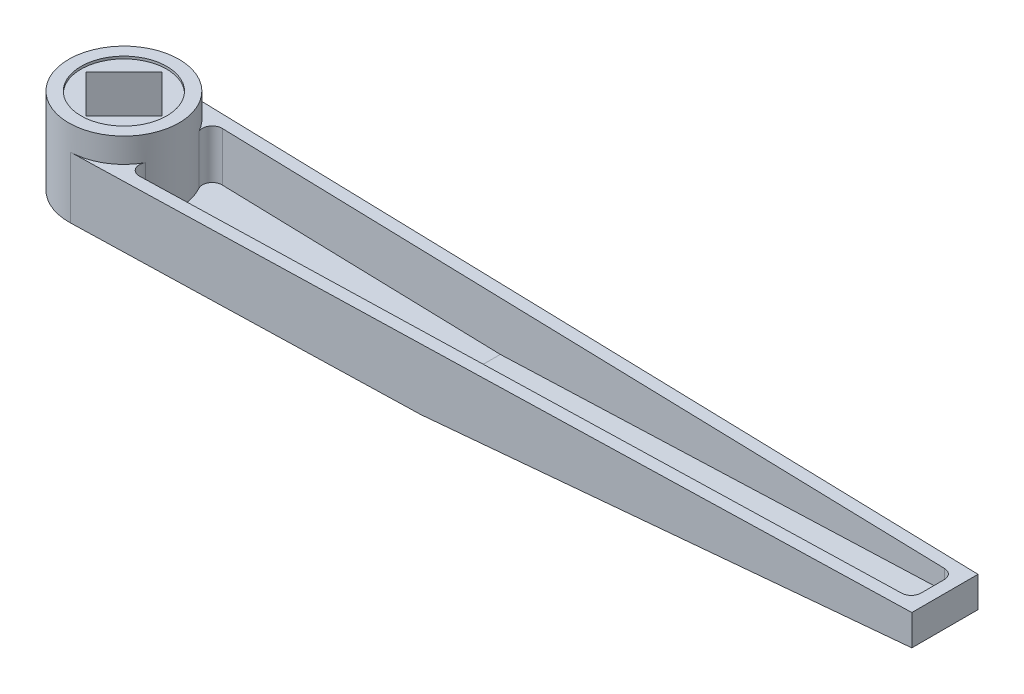
ISO-10303-21;
HEADER;
FILE_DESCRIPTION(('STEP AP214'),'2;1');
FILE_NAME('part.step','',(''),(''),'','','');
FILE_SCHEMA(('AUTOMOTIVE_DESIGN { 1 0 10303 214 1 1 1 1 }'));
ENDSEC;
DATA;
#1=APPLICATION_CONTEXT('core data for automotive mechanical design processes');
#2=APPLICATION_PROTOCOL_DEFINITION('international standard','automotive_design',2000,#1);
#3=PRODUCT_CONTEXT('',#1,'mechanical');
#4=PRODUCT('Part','Part','',(#3));
#5=PRODUCT_RELATED_PRODUCT_CATEGORY('part','',(#4));
#6=PRODUCT_DEFINITION_FORMATION('','',#4);
#7=PRODUCT_DEFINITION_CONTEXT('part definition',#1,'design');
#8=PRODUCT_DEFINITION('design','',#6,#7);
#9=PRODUCT_DEFINITION_SHAPE('','',#8);
#10=(LENGTH_UNIT() NAMED_UNIT(*) SI_UNIT(.MILLI.,.METRE.));
#11=(NAMED_UNIT(*) PLANE_ANGLE_UNIT() SI_UNIT($,.RADIAN.));
#12=(NAMED_UNIT(*) SI_UNIT($,.STERADIAN.) SOLID_ANGLE_UNIT());
#13=UNCERTAINTY_MEASURE_WITH_UNIT(LENGTH_MEASURE(1.E-05),#10,'distance_accuracy_value','');
#14=(GEOMETRIC_REPRESENTATION_CONTEXT(3) GLOBAL_UNCERTAINTY_ASSIGNED_CONTEXT((#13)) GLOBAL_UNIT_ASSIGNED_CONTEXT((#10,
#11,#12)) REPRESENTATION_CONTEXT('',''));
#15=CARTESIAN_POINT('',(0.,0.,0.));
#16=DIRECTION('',(0.,0.,1.));
#17=DIRECTION('',(1.,0.,0.));
#18=AXIS2_PLACEMENT_3D('',#15,#16,#17);
#19=CARTESIAN_POINT('',(0.,34.,0.));
#20=DIRECTION('',(0.,1.,0.));
#21=DIRECTION('',(0.,0.,1.));
#22=AXIS2_PLACEMENT_3D('',#19,#20,#21);
#23=PLANE('',#22);
#24=CARTESIAN_POINT('',(0.,34.,0.));
#25=DIRECTION('',(0.,1.,0.));
#26=DIRECTION('',(0.,0.,1.));
#27=AXIS2_PLACEMENT_3D('',#24,#25,#26);
#28=CIRCLE('',#27,17.5);
#29=CARTESIAN_POINT('',(0.,34.,17.5));
#30=VERTEX_POINT('',#29);
#31=EDGE_CURVE('E232',#30,#30,#28,.T.);
#32=ORIENTED_EDGE('',*,*,#31,.T.);
#33=EDGE_LOOP('',(#32));
#34=FACE_BOUND('',#33,.T.);
#35=DIRECTION('',(-0.707106781186548,0.,0.707106781186548));
#36=VECTOR('',#35,1.);
#37=CARTESIAN_POINT('',(7.77817459305201,34.,7.77817459305201));
#38=LINE('',#37,#36);
#39=CARTESIAN_POINT('',(15.556349186104,34.,0.));
#40=VERTEX_POINT('',#39);
#41=CARTESIAN_POINT('',(0.,34.,15.556349186104));
#42=VERTEX_POINT('',#41);
#43=EDGE_CURVE('E222',#40,#42,#38,.T.);
#44=ORIENTED_EDGE('',*,*,#43,.T.);
#45=DIRECTION('',(-0.707106781186548,0.,-0.707106781186547));
#46=VECTOR('',#45,1.);
#47=CARTESIAN_POINT('',(-7.77817459305201,34.,7.77817459305201));
#48=LINE('',#47,#46);
#49=CARTESIAN_POINT('',(-15.556349186104,34.,0.));
#50=VERTEX_POINT('',#49);
#51=EDGE_CURVE('E189',#42,#50,#48,.T.);
#52=ORIENTED_EDGE('',*,*,#51,.T.);
#53=DIRECTION('',(0.707106781186547,0.,-0.707106781186548));
#54=VECTOR('',#53,1.);
#55=CARTESIAN_POINT('',(-7.77817459305204,34.,-7.77817459305203));
#56=LINE('',#55,#54);
#57=CARTESIAN_POINT('',(0.,34.,-15.5563491861041));
#58=VERTEX_POINT('',#57);
#59=EDGE_CURVE('E192',#50,#58,#56,.T.);
#60=ORIENTED_EDGE('',*,*,#59,.T.);
#61=DIRECTION('',(0.707106781186548,0.,0.707106781186547));
#62=VECTOR('',#61,1.);
#63=CARTESIAN_POINT('',(7.77817459305203,34.,-7.77817459305204));
#64=LINE('',#63,#62);
#65=EDGE_CURVE('E219',#58,#40,#64,.T.);
#66=ORIENTED_EDGE('',*,*,#65,.T.);
#67=EDGE_LOOP('',(#44,#52,#60,#66));
#68=FACE_BOUND('',#67,.T.);
#69=ADVANCED_FACE('F57',(#34,#68),#23,.T.);
#70=CARTESIAN_POINT('',(0.,1.,0.));
#71=DIRECTION('',(0.,-1.,0.));
#72=DIRECTION('',(0.,0.,-1.));
#73=AXIS2_PLACEMENT_3D('',#70,#71,#72);
#74=PLANE('',#73);
#75=CARTESIAN_POINT('',(0.,1.,0.));
#76=DIRECTION('',(0.,-1.,0.));
#77=DIRECTION('',(0.,0.,-1.));
#78=AXIS2_PLACEMENT_3D('',#75,#76,#77);
#79=CIRCLE('',#78,17.5);
#80=CARTESIAN_POINT('',(0.,1.,-17.5));
#81=VERTEX_POINT('',#80);
#82=EDGE_CURVE('E226',#81,#81,#79,.T.);
#83=ORIENTED_EDGE('',*,*,#82,.T.);
#84=EDGE_LOOP('',(#83));
#85=FACE_BOUND('',#84,.T.);
#86=DIRECTION('',(-0.707106781186547,0.,0.707106781186548));
#87=VECTOR('',#86,1.);
#88=CARTESIAN_POINT('',(0.,1.,-15.5563491861041));
#89=LINE('',#88,#87);
#90=CARTESIAN_POINT('',(0.,1.,-15.5563491861041));
#91=VERTEX_POINT('',#90);
#92=CARTESIAN_POINT('',(-15.556349186104,1.,0.));
#93=VERTEX_POINT('',#92);
#94=EDGE_CURVE('E207',#91,#93,#89,.T.);
#95=ORIENTED_EDGE('',*,*,#94,.T.);
#96=DIRECTION('',(0.707106781186548,0.,0.707106781186547));
#97=VECTOR('',#96,1.);
#98=CARTESIAN_POINT('',(-15.556349186104,1.,0.));
#99=LINE('',#98,#97);
#100=CARTESIAN_POINT('',(0.,1.,15.556349186104));
#101=VERTEX_POINT('',#100);
#102=EDGE_CURVE('E186',#93,#101,#99,.T.);
#103=ORIENTED_EDGE('',*,*,#102,.T.);
#104=DIRECTION('',(0.707106781186548,0.,-0.707106781186548));
#105=VECTOR('',#104,1.);
#106=CARTESIAN_POINT('',(15.556349186104,1.,0.));
#107=LINE('',#106,#105);
#108=CARTESIAN_POINT('',(15.556349186104,1.,0.));
#109=VERTEX_POINT('',#108);
#110=EDGE_CURVE('E196',#101,#109,#107,.T.);
#111=ORIENTED_EDGE('',*,*,#110,.T.);
#112=DIRECTION('',(-0.707106781186548,0.,-0.707106781186547));
#113=VECTOR('',#112,1.);
#114=CARTESIAN_POINT('',(0.,1.,-15.5563491861041));
#115=LINE('',#114,#113);
#116=EDGE_CURVE('E202',#109,#91,#115,.T.);
#117=ORIENTED_EDGE('',*,*,#116,.T.);
#118=EDGE_LOOP('',(#95,#103,#111,#117));
#119=FACE_BOUND('',#118,.T.);
#120=ADVANCED_FACE('F205',(#85,#119),#74,.T.);
#121=CARTESIAN_POINT('',(-124.155415208462,25.,0.));
#122=DIRECTION('',(0.,1.,0.));
#123=DIRECTION('',(0.,0.,1.));
#124=AXIS2_PLACEMENT_3D('',#121,#122,#123);
#125=PLANE('',#124);
#126=DIRECTION('',(0.999638661252636,0.,0.0268802330539983));
#127=VECTOR('',#126,1.);
#128=CARTESIAN_POINT('',(-123.460901850765,25.,-25.8279904685282));
#129=LINE('',#128,#127);
#130=CARTESIAN_POINT('',(0.604805243714965,25.,-22.4918698781843));
#131=VERTEX_POINT('',#130);
#132=CARTESIAN_POINT('',(335.,25.,-13.5));
#133=VERTEX_POINT('',#132);
#134=EDGE_CURVE('E283',#131,#133,#129,.T.);
#135=ORIENTED_EDGE('',*,*,#134,.F.);
#136=CARTESIAN_POINT('',(0.,25.,0.));
#137=DIRECTION('',(0.,1.,0.));
#138=DIRECTION('',(0.,0.,1.));
#139=AXIS2_PLACEMENT_3D('',#136,#137,#138);
#140=CIRCLE('',#139,22.5);
#141=CARTESIAN_POINT('',(19.6625817653894,25.,-10.9376815788072));
#142=VERTEX_POINT('',#141);
#143=EDGE_CURVE('E246',#131,#142,#140,.F.);
#144=ORIENTED_EDGE('',*,*,#143,.T.);
#145=CARTESIAN_POINT('',(23.1581518570141,25.,-12.8821583039285));
#146=DIRECTION('',(0.,1.,0.));
#147=DIRECTION('',(0.,0.,1.));
#148=AXIS2_PLACEMENT_3D('',#145,#146,#147);
#149=CIRCLE('',#148,4.);
#150=CARTESIAN_POINT('',(23.2656727892302,25.,-16.880712948939));
#151=VERTEX_POINT('',#150);
#152=EDGE_CURVE('E333',#142,#151,#149,.F.);
#153=ORIENTED_EDGE('',*,*,#152,.T.);
#154=DIRECTION('',(0.999638661252636,0.,0.0268802330539983));
#155=VECTOR('',#154,1.);
#156=CARTESIAN_POINT('',(-123.595303016035,25.,-20.829797162265));
#157=LINE('',#156,#155);
#158=CARTESIAN_POINT('',(326.107520932216,25.,-8.73731096568009));
#159=VERTEX_POINT('',#158);
#160=EDGE_CURVE('E269',#151,#159,#157,.T.);
#161=ORIENTED_EDGE('',*,*,#160,.T.);
#162=CARTESIAN_POINT('',(326.,25.,-4.73875632066954));
#163=DIRECTION('',(0.,1.,0.));
#164=DIRECTION('',(0.,0.,1.));
#165=AXIS2_PLACEMENT_3D('',#162,#163,#164);
#166=CIRCLE('',#165,4.);
#167=CARTESIAN_POINT('',(330.,25.,-4.73875632066954));
#168=VERTEX_POINT('',#167);
#169=EDGE_CURVE('E12',#159,#168,#166,.F.);
#170=ORIENTED_EDGE('',*,*,#169,.T.);
#171=DIRECTION('',(0.,0.,1.));
#172=VECTOR('',#171,1.);
#173=CARTESIAN_POINT('',(330.,25.,0.));
#174=LINE('',#173,#172);
#175=CARTESIAN_POINT('',(330.,25.,4.73875632066954));
#176=VERTEX_POINT('',#175);
#177=EDGE_CURVE('E258',#168,#176,#174,.T.);
#178=ORIENTED_EDGE('',*,*,#177,.T.);
#179=CARTESIAN_POINT('',(326.,25.,4.73875632066954));
#180=DIRECTION('',(0.,1.,0.));
#181=DIRECTION('',(0.,0.,1.));
#182=AXIS2_PLACEMENT_3D('',#179,#180,#181);
#183=CIRCLE('',#182,4.);
#184=CARTESIAN_POINT('',(326.107520932216,25.,8.73731096568009));
#185=VERTEX_POINT('',#184);
#186=EDGE_CURVE('E65',#176,#185,#183,.F.);
#187=ORIENTED_EDGE('',*,*,#186,.T.);
#188=DIRECTION('',(0.999638661252636,0.,-0.0268802330539983));
#189=VECTOR('',#188,1.);
#190=CARTESIAN_POINT('',(-123.595303016035,25.,20.829797162265));
#191=LINE('',#190,#189);
#192=CARTESIAN_POINT('',(23.2656727892302,25.,16.880712948939));
#193=VERTEX_POINT('',#192);
#194=EDGE_CURVE('E266',#193,#185,#191,.T.);
#195=ORIENTED_EDGE('',*,*,#194,.F.);
#196=CARTESIAN_POINT('',(23.1581518570141,25.,12.8821583039285));
#197=DIRECTION('',(0.,1.,0.));
#198=DIRECTION('',(0.,0.,1.));
#199=AXIS2_PLACEMENT_3D('',#196,#197,#198);
#200=CIRCLE('',#199,4.);
#201=CARTESIAN_POINT('',(19.6625817653894,25.,10.9376815788072));
#202=VERTEX_POINT('',#201);
#203=EDGE_CURVE('E335',#193,#202,#200,.F.);
#204=ORIENTED_EDGE('',*,*,#203,.T.);
#205=CARTESIAN_POINT('',(0.604805243714965,25.,22.4918698781843));
#206=VERTEX_POINT('',#205);
#207=EDGE_CURVE('E248',#202,#206,#140,.F.);
#208=ORIENTED_EDGE('',*,*,#207,.T.);
#209=DIRECTION('',(0.999638661252636,0.,-0.0268802330539983));
#210=VECTOR('',#209,1.);
#211=CARTESIAN_POINT('',(-123.460901850765,25.,25.8279904685282));
#212=LINE('',#211,#210);
#213=CARTESIAN_POINT('',(335.,25.,13.5));
#214=VERTEX_POINT('',#213);
#215=EDGE_CURVE('E287',#206,#214,#212,.T.);
#216=ORIENTED_EDGE('',*,*,#215,.T.);
#217=DIRECTION('',(0.,0.,1.));
#218=VECTOR('',#217,1.);
#219=CARTESIAN_POINT('',(335.,25.,0.));
#220=LINE('',#219,#218);
#221=EDGE_CURVE('E280',#133,#214,#220,.T.);
#222=ORIENTED_EDGE('',*,*,#221,.F.);
#223=EDGE_LOOP('',(#135,#144,#153,#161,#170,#178,#187,#195,#204,#208,#216,#222));
#224=FACE_BOUND('',#223,.T.);
#225=ADVANCED_FACE('F340',(#224),#125,.T.);
#226=CARTESIAN_POINT('',(-124.155415208462,5.,0.));
#227=DIRECTION('',(0.,1.,0.));
#228=DIRECTION('',(0.,0.,1.));
#229=AXIS2_PLACEMENT_3D('',#226,#227,#228);
#230=PLANE('',#229);
#231=DIRECTION('',(0.999638661252636,0.,0.0268802330539983));
#232=VECTOR('',#231,1.);
#233=CARTESIAN_POINT('',(-123.595303016035,5.,-20.829797162265));
#234=LINE('',#233,#232);
#235=CARTESIAN_POINT('',(23.2656727892302,5.,-16.880712948939));
#236=VERTEX_POINT('',#235);
#237=CARTESIAN_POINT('',(139.839907881324,5.,-13.7460376619304));
#238=VERTEX_POINT('',#237);
#239=EDGE_CURVE('E249',#236,#238,#234,.T.);
#240=ORIENTED_EDGE('',*,*,#239,.F.);
#241=CARTESIAN_POINT('',(23.1581518570141,5.,-12.8821583039285));
#242=DIRECTION('',(0.,1.,0.));
#243=DIRECTION('',(0.,0.,1.));
#244=AXIS2_PLACEMENT_3D('',#241,#242,#243);
#245=CIRCLE('',#244,4.);
#246=CARTESIAN_POINT('',(19.6625817653894,5.,-10.9376815788072));
#247=VERTEX_POINT('',#246);
#248=EDGE_CURVE('E317',#236,#247,#245,.T.);
#249=ORIENTED_EDGE('',*,*,#248,.T.);
#250=CARTESIAN_POINT('',(0.,5.,0.));
#251=DIRECTION('',(0.,1.,0.));
#252=DIRECTION('',(0.,0.,1.));
#253=AXIS2_PLACEMENT_3D('',#250,#251,#252);
#254=CIRCLE('',#253,22.5);
#255=CARTESIAN_POINT('',(19.6625817653894,5.,10.9376815788072));
#256=VERTEX_POINT('',#255);
#257=EDGE_CURVE('E241',#247,#256,#254,.F.);
#258=ORIENTED_EDGE('',*,*,#257,.T.);
#259=CARTESIAN_POINT('',(23.1581518570141,5.,12.8821583039285));
#260=DIRECTION('',(0.,1.,0.));
#261=DIRECTION('',(0.,0.,1.));
#262=AXIS2_PLACEMENT_3D('',#259,#260,#261);
#263=CIRCLE('',#262,4.);
#264=CARTESIAN_POINT('',(23.2656727892302,5.,16.880712948939));
#265=VERTEX_POINT('',#264);
#266=EDGE_CURVE('E315',#256,#265,#263,.T.);
#267=ORIENTED_EDGE('',*,*,#266,.T.);
#268=DIRECTION('',(0.999638661252636,0.,-0.0268802330539983));
#269=VECTOR('',#268,1.);
#270=CARTESIAN_POINT('',(-123.595303016035,5.,20.829797162265));
#271=LINE('',#270,#269);
#272=CARTESIAN_POINT('',(139.839907881324,5.,13.7460376619304));
#273=VERTEX_POINT('',#272);
#274=EDGE_CURVE('E251',#265,#273,#271,.T.);
#275=ORIENTED_EDGE('',*,*,#274,.T.);
#276=DIRECTION('',(0.,0.,1.));
#277=VECTOR('',#276,1.);
#278=CARTESIAN_POINT('',(139.839907881324,5.,0.));
#279=LINE('',#278,#277);
#280=EDGE_CURVE('E253',#238,#273,#279,.T.);
#281=ORIENTED_EDGE('',*,*,#280,.F.);
#282=EDGE_LOOP('',(#240,#249,#258,#267,#275,#281));
#283=FACE_BOUND('',#282,.T.);
#284=ADVANCED_FACE('F365',(#283),#230,.T.);
#285=CARTESIAN_POINT('',(-123.595303016035,25.,20.829797162265));
#286=DIRECTION('',(-0.0268802330539983,0.,-0.999638661252636));
#287=DIRECTION('',(-0.999638661252636,0.,0.0268802330539983));
#288=AXIS2_PLACEMENT_3D('',#285,#286,#287);
#289=PLANE('',#288);
#290=ORIENTED_EDGE('',*,*,#274,.F.);
#291=DIRECTION('',(0.,-1.,0.));
#292=VECTOR('',#291,1.);
#293=CARTESIAN_POINT('',(23.2656727892302,25.,16.880712948939));
#294=LINE('',#293,#292);
#295=EDGE_CURVE('E322',#265,#193,#294,.F.);
#296=ORIENTED_EDGE('',*,*,#295,.T.);
#297=ORIENTED_EDGE('',*,*,#194,.T.);
#298=DIRECTION('',(0.,-1.,0.));
#299=VECTOR('',#298,1.);
#300=CARTESIAN_POINT('',(326.107520932216,25.,8.73731096568009));
#301=LINE('',#300,#299);
#302=CARTESIAN_POINT('',(326.107520932216,16.9402316058265,8.73731096568009));
#303=VERTEX_POINT('',#302);
#304=EDGE_CURVE('E319',#185,#303,#301,.T.);
#305=ORIENTED_EDGE('',*,*,#304,.T.);
#306=DIRECTION('',(0.997592617173697,0.0639482446906216,-0.0268252150321745));
#307=VECTOR('',#306,1.);
#308=CARTESIAN_POINT('',(-121.242130924735,-11.7360281285935,20.7665204837189));
#309=LINE('',#308,#307);
#310=EDGE_CURVE('E252',#273,#303,#309,.T.);
#311=ORIENTED_EDGE('',*,*,#310,.F.);
#312=EDGE_LOOP('',(#290,#296,#297,#305,#311));
#313=FACE_BOUND('',#312,.T.);
#314=ADVANCED_FACE('F345',(#313),#289,.T.);
#315=CARTESIAN_POINT('',(-123.595303016035,25.,-20.829797162265));
#316=DIRECTION('',(0.0268802330539983,0.,-0.999638661252636));
#317=DIRECTION('',(-0.999638661252636,0.,-0.0268802330539983));
#318=AXIS2_PLACEMENT_3D('',#315,#316,#317);
#319=PLANE('',#318);
#320=ORIENTED_EDGE('',*,*,#160,.F.);
#321=DIRECTION('',(0.,1.,0.));
#322=VECTOR('',#321,1.);
#323=CARTESIAN_POINT('',(23.2656727892301,5.,-16.880712948939));
#324=LINE('',#323,#322);
#325=EDGE_CURVE('E313',#151,#236,#324,.F.);
#326=ORIENTED_EDGE('',*,*,#325,.T.);
#327=ORIENTED_EDGE('',*,*,#239,.T.);
#328=DIRECTION('',(0.997592617173697,0.0639482446906216,0.0268252150321745));
#329=VECTOR('',#328,1.);
#330=CARTESIAN_POINT('',(-121.242130924735,-11.7360281285935,-20.7665204837189));
#331=LINE('',#330,#329);
#332=CARTESIAN_POINT('',(326.107520932216,16.9402316058265,-8.73731096568009));
#333=VERTEX_POINT('',#332);
#334=EDGE_CURVE('E262',#238,#333,#331,.T.);
#335=ORIENTED_EDGE('',*,*,#334,.T.);
#336=DIRECTION('',(0.,-1.,0.));
#337=VECTOR('',#336,1.);
#338=CARTESIAN_POINT('',(326.107520932216,25.,-8.73731096568009));
#339=LINE('',#338,#337);
#340=EDGE_CURVE('E311',#333,#159,#339,.F.);
#341=ORIENTED_EDGE('',*,*,#340,.T.);
#342=EDGE_LOOP('',(#320,#326,#327,#335,#341));
#343=FACE_BOUND('',#342,.T.);
#344=ADVANCED_FACE('F359',(#343),#319,.F.);
#345=CARTESIAN_POINT('',(-124.155415208462,0.,0.));
#346=DIRECTION('',(0.,1.,0.));
#347=DIRECTION('',(0.,0.,1.));
#348=AXIS2_PLACEMENT_3D('',#345,#346,#347);
#349=PLANE('',#348);
#350=CARTESIAN_POINT('',(0.,0.,0.));
#351=DIRECTION('',(0.,-1.,0.));
#352=DIRECTION('',(0.,0.,-1.));
#353=AXIS2_PLACEMENT_3D('',#350,#351,#352);
#354=CIRCLE('',#353,17.5);
#355=CARTESIAN_POINT('',(0.,0.,-17.5));
#356=VERTEX_POINT('',#355);
#357=EDGE_CURVE('E225',#356,#356,#354,.T.);
#358=ORIENTED_EDGE('',*,*,#357,.F.);
#359=EDGE_LOOP('',(#358));
#360=FACE_BOUND('',#359,.T.);
#361=CARTESIAN_POINT('',(0.,0.,0.));
#362=DIRECTION('',(0.,1.,0.));
#363=DIRECTION('',(0.,0.,1.));
#364=AXIS2_PLACEMENT_3D('',#361,#362,#363);
#365=CIRCLE('',#364,22.5);
#366=CARTESIAN_POINT('',(0.604805243714965,0.,-22.4918698781843));
#367=VERTEX_POINT('',#366);
#368=CARTESIAN_POINT('',(0.604805243714965,0.,22.4918698781843));
#369=VERTEX_POINT('',#368);
#370=EDGE_CURVE('E235',#367,#369,#365,.T.);
#371=ORIENTED_EDGE('',*,*,#370,.F.);
#372=DIRECTION('',(0.999638661252636,0.,0.0268802330539983));
#373=VECTOR('',#372,1.);
#374=CARTESIAN_POINT('',(-123.460901850765,0.,-25.8279904685282));
#375=LINE('',#374,#373);
#376=CARTESIAN_POINT('',(140.,0.,-18.7435401397555));
#377=VERTEX_POINT('',#376);
#378=EDGE_CURVE('E279',#367,#377,#375,.T.);
#379=ORIENTED_EDGE('',*,*,#378,.T.);
#380=DIRECTION('',(0.,0.,1.));
#381=VECTOR('',#380,1.);
#382=CARTESIAN_POINT('',(140.,0.,-22.4918698781843));
#383=LINE('',#382,#381);
#384=CARTESIAN_POINT('',(140.,0.,18.7435401397555));
#385=VERTEX_POINT('',#384);
#386=EDGE_CURVE('E272',#377,#385,#383,.T.);
#387=ORIENTED_EDGE('',*,*,#386,.T.);
#388=DIRECTION('',(0.999638661252636,0.,-0.0268802330539983));
#389=VECTOR('',#388,1.);
#390=CARTESIAN_POINT('',(-123.460901850765,0.,25.8279904685282));
#391=LINE('',#390,#389);
#392=EDGE_CURVE('E284',#369,#385,#391,.T.);
#393=ORIENTED_EDGE('',*,*,#392,.F.);
#394=EDGE_LOOP('',(#371,#379,#387,#393));
#395=FACE_BOUND('',#394,.T.);
#396=ADVANCED_FACE('F383',(#360,#395),#349,.F.);
#397=CARTESIAN_POINT('',(-123.460901850765,25.,25.8279904685282));
#398=DIRECTION('',(-0.0268802330539983,0.,-0.999638661252636));
#399=DIRECTION('',(-0.999638661252636,0.,0.0268802330539983));
#400=AXIS2_PLACEMENT_3D('',#397,#398,#399);
#401=PLANE('',#400);
#402=ORIENTED_EDGE('',*,*,#392,.T.);
#403=DIRECTION('',(0.997592617173697,0.0639482446906216,-0.0268252150321745));
#404=VECTOR('',#403,1.);
#405=CARTESIAN_POINT('',(-120.788653215522,-16.7172213599694,25.7561338378497));
#406=LINE('',#405,#404);
#407=CARTESIAN_POINT('',(335.,12.5,13.5));
#408=VERTEX_POINT('',#407);
#409=EDGE_CURVE('E275',#385,#408,#406,.T.);
#410=ORIENTED_EDGE('',*,*,#409,.T.);
#411=DIRECTION('',(0.,-1.,0.));
#412=VECTOR('',#411,1.);
#413=CARTESIAN_POINT('',(335.,25.,13.5));
#414=LINE('',#413,#412);
#415=EDGE_CURVE('E289',#214,#408,#414,.T.);
#416=ORIENTED_EDGE('',*,*,#415,.F.);
#417=ORIENTED_EDGE('',*,*,#215,.F.);
#418=DIRECTION('',(0.,-1.,0.));
#419=VECTOR('',#418,1.);
#420=CARTESIAN_POINT('',(0.604805243714965,25.,22.4918698781843));
#421=LINE('',#420,#419);
#422=EDGE_CURVE('E296',#206,#369,#421,.T.);
#423=ORIENTED_EDGE('',*,*,#422,.T.);
#424=EDGE_LOOP('',(#402,#410,#416,#417,#423));
#425=FACE_BOUND('',#424,.T.);
#426=ADVANCED_FACE('F376',(#425),#401,.F.);
#427=CARTESIAN_POINT('',(335.,25.,0.));
#428=DIRECTION('',(1.,0.,0.));
#429=DIRECTION('',(0.,0.,-1.));
#430=AXIS2_PLACEMENT_3D('',#427,#428,#429);
#431=PLANE('',#430);
#432=DIRECTION('',(0.,0.,1.));
#433=VECTOR('',#432,1.);
#434=CARTESIAN_POINT('',(335.,12.5,-22.4918698781843));
#435=LINE('',#434,#433);
#436=CARTESIAN_POINT('',(335.,12.5,-13.5));
#437=VERTEX_POINT('',#436);
#438=EDGE_CURVE('E265',#437,#408,#435,.T.);
#439=ORIENTED_EDGE('',*,*,#438,.F.);
#440=DIRECTION('',(0.,-1.,0.));
#441=VECTOR('',#440,1.);
#442=CARTESIAN_POINT('',(335.,25.,-13.5));
#443=LINE('',#442,#441);
#444=EDGE_CURVE('E301',#133,#437,#443,.T.);
#445=ORIENTED_EDGE('',*,*,#444,.F.);
#446=ORIENTED_EDGE('',*,*,#221,.T.);
#447=ORIENTED_EDGE('',*,*,#415,.T.);
#448=EDGE_LOOP('',(#439,#445,#446,#447));
#449=FACE_BOUND('',#448,.T.);
#450=ADVANCED_FACE('F387',(#449),#431,.T.);
#451=CARTESIAN_POINT('',(-123.460901850765,25.,-25.8279904685282));
#452=DIRECTION('',(0.0268802330539983,0.,-0.999638661252636));
#453=DIRECTION('',(-0.999638661252636,0.,-0.0268802330539983));
#454=AXIS2_PLACEMENT_3D('',#451,#452,#453);
#455=PLANE('',#454);
#456=DIRECTION('',(0.997592617173697,0.0639482446906216,0.0268252150321745));
#457=VECTOR('',#456,1.);
#458=CARTESIAN_POINT('',(-120.788653215522,-16.7172213599694,-25.7561338378497));
#459=LINE('',#458,#457);
#460=EDGE_CURVE('E304',#377,#437,#459,.T.);
#461=ORIENTED_EDGE('',*,*,#460,.F.);
#462=ORIENTED_EDGE('',*,*,#378,.F.);
#463=DIRECTION('',(0.,-1.,0.));
#464=VECTOR('',#463,1.);
#465=CARTESIAN_POINT('',(0.604805243714965,25.,-22.4918698781843));
#466=LINE('',#465,#464);
#467=EDGE_CURVE('E298',#131,#367,#466,.T.);
#468=ORIENTED_EDGE('',*,*,#467,.F.);
#469=ORIENTED_EDGE('',*,*,#134,.T.);
#470=ORIENTED_EDGE('',*,*,#444,.T.);
#471=EDGE_LOOP('',(#461,#462,#468,#469,#470));
#472=FACE_BOUND('',#471,.T.);
#473=ADVANCED_FACE('F390',(#472),#455,.T.);
#474=CARTESIAN_POINT('',(335.,12.5,-22.4918698781843));
#475=DIRECTION('',(-0.063971265443343,0.997951740916151,0.));
#476=DIRECTION('',(-0.997951740916152,-0.063971265443343,0.));
#477=AXIS2_PLACEMENT_3D('',#474,#475,#476);
#478=PLANE('',#477);
#479=ORIENTED_EDGE('',*,*,#386,.F.);
#480=ORIENTED_EDGE('',*,*,#460,.T.);
#481=ORIENTED_EDGE('',*,*,#438,.T.);
#482=ORIENTED_EDGE('',*,*,#409,.F.);
#483=EDGE_LOOP('',(#479,#480,#481,#482));
#484=FACE_BOUND('',#483,.T.);
#485=ADVANCED_FACE('F391',(#484),#478,.F.);
#486=CARTESIAN_POINT('',(330.,25.,0.));
#487=DIRECTION('',(1.,0.,0.));
#488=DIRECTION('',(0.,0.,-1.));
#489=AXIS2_PLACEMENT_3D('',#486,#487,#488);
#490=PLANE('',#489);
#491=DIRECTION('',(0.,0.,1.));
#492=VECTOR('',#491,1.);
#493=CARTESIAN_POINT('',(330.,17.189749494787,0.));
#494=LINE('',#493,#492);
#495=CARTESIAN_POINT('',(330.,17.189749494787,-4.73875632066954));
#496=VERTEX_POINT('',#495);
#497=CARTESIAN_POINT('',(330.,17.189749494787,4.73875632066954));
#498=VERTEX_POINT('',#497);
#499=EDGE_CURVE('E256',#496,#498,#494,.T.);
#500=ORIENTED_EDGE('',*,*,#499,.T.);
#501=DIRECTION('',(0.,-1.,0.));
#502=VECTOR('',#501,1.);
#503=CARTESIAN_POINT('',(330.,25.,4.73875632066954));
#504=LINE('',#503,#502);
#505=EDGE_CURVE('E72',#498,#176,#504,.F.);
#506=ORIENTED_EDGE('',*,*,#505,.T.);
#507=ORIENTED_EDGE('',*,*,#177,.F.);
#508=DIRECTION('',(0.,-1.,0.));
#509=VECTOR('',#508,1.);
#510=CARTESIAN_POINT('',(330.,17.189749494787,-4.73875632066954));
#511=LINE('',#510,#509);
#512=EDGE_CURVE('E329',#168,#496,#511,.T.);
#513=ORIENTED_EDGE('',*,*,#512,.T.);
#514=EDGE_LOOP('',(#500,#506,#507,#513));
#515=FACE_BOUND('',#514,.T.);
#516=ADVANCED_FACE('F352',(#515),#490,.F.);
#517=CARTESIAN_POINT('',(334.680143672783,17.4897587045808,-22.4918698781843));
#518=DIRECTION('',(-0.063971265443343,0.997951740916151,0.));
#519=DIRECTION('',(-0.997951740916152,-0.063971265443343,0.));
#520=AXIS2_PLACEMENT_3D('',#517,#518,#519);
#521=PLANE('',#520);
#522=ORIENTED_EDGE('',*,*,#310,.T.);
#523=CARTESIAN_POINT('',(326.,16.9333392383767,4.73875632066954));
#524=DIRECTION('',(-0.063971265443343,0.997951740916151,0.));
#525=DIRECTION('',(-0.997951740916152,-0.063971265443343,0.));
#526=AXIS2_PLACEMENT_3D('',#523,#524,#525);
#527=ELLIPSE('',#526,4.00820985223982,4.);
#528=EDGE_CURVE('E327',#303,#498,#527,.T.);
#529=ORIENTED_EDGE('',*,*,#528,.T.);
#530=ORIENTED_EDGE('',*,*,#499,.F.);
#531=CARTESIAN_POINT('',(326.,16.9333392383767,-4.73875632066954));
#532=DIRECTION('',(-0.063971265443343,0.997951740916151,0.));
#533=DIRECTION('',(0.997951740916152,0.063971265443343,0.));
#534=AXIS2_PLACEMENT_3D('',#531,#532,#533);
#535=ELLIPSE('',#534,4.00820985223982,4.);
#536=EDGE_CURVE('E325',#496,#333,#535,.T.);
#537=ORIENTED_EDGE('',*,*,#536,.T.);
#538=ORIENTED_EDGE('',*,*,#334,.F.);
#539=ORIENTED_EDGE('',*,*,#280,.T.);
#540=EDGE_LOOP('',(#522,#529,#530,#537,#538,#539));
#541=FACE_BOUND('',#540,.T.);
#542=ADVANCED_FACE('F351',(#541),#521,.T.);
#543=CARTESIAN_POINT('',(0.,35.,0.));
#544=DIRECTION('',(0.,-1.,0.));
#545=DIRECTION('',(0.,0.,-1.));
#546=AXIS2_PLACEMENT_3D('',#543,#544,#545);
#547=CYLINDRICAL_SURFACE('',#546,22.5);
#548=CARTESIAN_POINT('',(0.,35.,0.));
#549=DIRECTION('',(0.,1.,0.));
#550=DIRECTION('',(0.,0.,1.));
#551=AXIS2_PLACEMENT_3D('',#548,#549,#550);
#552=CIRCLE('',#551,22.5);
#553=CARTESIAN_POINT('',(0.,35.,22.5));
#554=VERTEX_POINT('',#553);
#555=EDGE_CURVE('E238',#554,#554,#552,.T.);
#556=ORIENTED_EDGE('',*,*,#555,.F.);
#557=EDGE_LOOP('',(#556));
#558=FACE_BOUND('',#557,.T.);
#559=ORIENTED_EDGE('',*,*,#257,.F.);
#560=DIRECTION('',(0.,-1.,0.));
#561=VECTOR('',#560,1.);
#562=CARTESIAN_POINT('',(19.6625817653894,35.,-10.9376815788072));
#563=LINE('',#562,#561);
#564=EDGE_CURVE('E308',#247,#142,#563,.F.);
#565=ORIENTED_EDGE('',*,*,#564,.T.);
#566=ORIENTED_EDGE('',*,*,#143,.F.);
#567=ORIENTED_EDGE('',*,*,#467,.T.);
#568=ORIENTED_EDGE('',*,*,#370,.T.);
#569=ORIENTED_EDGE('',*,*,#422,.F.);
#570=ORIENTED_EDGE('',*,*,#207,.F.);
#571=DIRECTION('',(0.,-1.,0.));
#572=VECTOR('',#571,1.);
#573=CARTESIAN_POINT('',(19.6625817653894,35.,10.9376815788072));
#574=LINE('',#573,#572);
#575=EDGE_CURVE('E306',#202,#256,#574,.T.);
#576=ORIENTED_EDGE('',*,*,#575,.T.);
#577=EDGE_LOOP('',(#559,#565,#566,#567,#568,#569,#570,#576));
#578=FACE_BOUND('',#577,.T.);
#579=ADVANCED_FACE('F379',(#558,#578),#547,.T.);
#580=CARTESIAN_POINT('',(0.,35.,0.));
#581=DIRECTION('',(0.,1.,0.));
#582=DIRECTION('',(0.,0.,1.));
#583=AXIS2_PLACEMENT_3D('',#580,#581,#582);
#584=PLANE('',#583);
#585=CARTESIAN_POINT('',(0.,35.,0.));
#586=DIRECTION('',(0.,1.,0.));
#587=DIRECTION('',(0.,0.,1.));
#588=AXIS2_PLACEMENT_3D('',#585,#586,#587);
#589=CIRCLE('',#588,17.5);
#590=CARTESIAN_POINT('',(0.,35.,17.5));
#591=VERTEX_POINT('',#590);
#592=EDGE_CURVE('E229',#591,#591,#589,.T.);
#593=ORIENTED_EDGE('',*,*,#592,.F.);
#594=EDGE_LOOP('',(#593));
#595=FACE_BOUND('',#594,.T.);
#596=ORIENTED_EDGE('',*,*,#555,.T.);
#597=EDGE_LOOP('',(#596));
#598=FACE_BOUND('',#597,.T.);
#599=ADVANCED_FACE('F417',(#595,#598),#584,.T.);
#600=CARTESIAN_POINT('',(0.,34.,0.));
#601=DIRECTION('',(0.,1.,0.));
#602=DIRECTION('',(0.,0.,1.));
#603=AXIS2_PLACEMENT_3D('',#600,#601,#602);
#604=CYLINDRICAL_SURFACE('',#603,17.5);
#605=ORIENTED_EDGE('',*,*,#31,.F.);
#606=EDGE_LOOP('',(#605));
#607=FACE_BOUND('',#606,.T.);
#608=ORIENTED_EDGE('',*,*,#592,.T.);
#609=EDGE_LOOP('',(#608));
#610=FACE_BOUND('',#609,.T.);
#611=ADVANCED_FACE('F414',(#607,#610),#604,.F.);
#612=CARTESIAN_POINT('',(0.,1.,0.));
#613=DIRECTION('',(0.,-1.,0.));
#614=DIRECTION('',(0.,0.,-1.));
#615=AXIS2_PLACEMENT_3D('',#612,#613,#614);
#616=CYLINDRICAL_SURFACE('',#615,17.5);
#617=ORIENTED_EDGE('',*,*,#82,.F.);
#618=EDGE_LOOP('',(#617));
#619=FACE_BOUND('',#618,.T.);
#620=ORIENTED_EDGE('',*,*,#357,.T.);
#621=EDGE_LOOP('',(#620));
#622=FACE_BOUND('',#621,.T.);
#623=ADVANCED_FACE('F413',(#619,#622),#616,.F.);
#624=CARTESIAN_POINT('',(-15.556349186104,35.,0.));
#625=DIRECTION('',(0.707106781186547,0.,-0.707106781186548));
#626=DIRECTION('',(-0.707106781186548,0.,-0.707106781186547));
#627=AXIS2_PLACEMENT_3D('',#624,#625,#626);
#628=PLANE('',#627);
#629=DIRECTION('',(0.,-1.,0.));
#630=VECTOR('',#629,1.);
#631=CARTESIAN_POINT('',(0.,35.,15.556349186104));
#632=LINE('',#631,#630);
#633=EDGE_CURVE('E181',#42,#101,#632,.T.);
#634=ORIENTED_EDGE('',*,*,#633,.T.);
#635=ORIENTED_EDGE('',*,*,#102,.F.);
#636=DIRECTION('',(0.,-1.,0.));
#637=VECTOR('',#636,1.);
#638=CARTESIAN_POINT('',(-15.556349186104,35.,0.));
#639=LINE('',#638,#637);
#640=EDGE_CURVE('E212',#50,#93,#639,.T.);
#641=ORIENTED_EDGE('',*,*,#640,.F.);
#642=ORIENTED_EDGE('',*,*,#51,.F.);
#643=EDGE_LOOP('',(#634,#635,#641,#642));
#644=FACE_BOUND('',#643,.T.);
#645=ADVANCED_FACE('F183',(#644),#628,.T.);
#646=CARTESIAN_POINT('',(15.556349186104,35.,0.));
#647=DIRECTION('',(-0.707106781186547,0.,-0.707106781186547));
#648=DIRECTION('',(-0.707106781186548,0.,0.707106781186548));
#649=AXIS2_PLACEMENT_3D('',#646,#647,#648);
#650=PLANE('',#649);
#651=DIRECTION('',(0.,-1.,0.));
#652=VECTOR('',#651,1.);
#653=CARTESIAN_POINT('',(15.556349186104,35.,0.));
#654=LINE('',#653,#652);
#655=EDGE_CURVE('E193',#40,#109,#654,.T.);
#656=ORIENTED_EDGE('',*,*,#655,.T.);
#657=ORIENTED_EDGE('',*,*,#110,.F.);
#658=ORIENTED_EDGE('',*,*,#633,.F.);
#659=ORIENTED_EDGE('',*,*,#43,.F.);
#660=EDGE_LOOP('',(#656,#657,#658,#659));
#661=FACE_BOUND('',#660,.T.);
#662=ADVANCED_FACE('F197',(#661),#650,.T.);
#663=CARTESIAN_POINT('',(0.,35.,-15.5563491861041));
#664=DIRECTION('',(-0.707106781186547,0.,0.707106781186548));
#665=DIRECTION('',(0.707106781186548,0.,0.707106781186547));
#666=AXIS2_PLACEMENT_3D('',#663,#664,#665);
#667=PLANE('',#666);
#668=DIRECTION('',(0.,-1.,0.));
#669=VECTOR('',#668,1.);
#670=CARTESIAN_POINT('',(0.,35.,-15.5563491861041));
#671=LINE('',#670,#669);
#672=EDGE_CURVE('E214',#58,#91,#671,.T.);
#673=ORIENTED_EDGE('',*,*,#672,.T.);
#674=ORIENTED_EDGE('',*,*,#116,.F.);
#675=ORIENTED_EDGE('',*,*,#655,.F.);
#676=ORIENTED_EDGE('',*,*,#65,.F.);
#677=EDGE_LOOP('',(#673,#674,#675,#676));
#678=FACE_BOUND('',#677,.T.);
#679=ADVANCED_FACE('F469',(#678),#667,.T.);
#680=CARTESIAN_POINT('',(0.,35.,-15.5563491861041));
#681=DIRECTION('',(0.707106781186548,0.,0.707106781186547));
#682=DIRECTION('',(0.707106781186547,0.,-0.707106781186548));
#683=AXIS2_PLACEMENT_3D('',#680,#681,#682);
#684=PLANE('',#683);
#685=ORIENTED_EDGE('',*,*,#640,.T.);
#686=ORIENTED_EDGE('',*,*,#94,.F.);
#687=ORIENTED_EDGE('',*,*,#672,.F.);
#688=ORIENTED_EDGE('',*,*,#59,.F.);
#689=EDGE_LOOP('',(#685,#686,#687,#688));
#690=FACE_BOUND('',#689,.T.);
#691=ADVANCED_FACE('F476',(#690),#684,.T.);
#692=CARTESIAN_POINT('',(23.1581518570141,35.,-12.8821583039285));
#693=DIRECTION('',(0.,-1.,0.));
#694=DIRECTION('',(0.,0.,-1.));
#695=AXIS2_PLACEMENT_3D('',#692,#693,#694);
#696=CYLINDRICAL_SURFACE('',#695,4.);
#697=ORIENTED_EDGE('',*,*,#248,.F.);
#698=ORIENTED_EDGE('',*,*,#325,.F.);
#699=ORIENTED_EDGE('',*,*,#152,.F.);
#700=ORIENTED_EDGE('',*,*,#564,.F.);
#701=EDGE_LOOP('',(#697,#698,#699,#700));
#702=FACE_BOUND('',#701,.T.);
#703=ADVANCED_FACE('F484',(#702),#696,.F.);
#704=CARTESIAN_POINT('',(23.1581518570141,35.,12.8821583039285));
#705=DIRECTION('',(0.,-1.,0.));
#706=DIRECTION('',(0.,0.,-1.));
#707=AXIS2_PLACEMENT_3D('',#704,#705,#706);
#708=CYLINDRICAL_SURFACE('',#707,4.);
#709=ORIENTED_EDGE('',*,*,#266,.F.);
#710=ORIENTED_EDGE('',*,*,#575,.F.);
#711=ORIENTED_EDGE('',*,*,#203,.F.);
#712=ORIENTED_EDGE('',*,*,#295,.F.);
#713=EDGE_LOOP('',(#709,#710,#711,#712));
#714=FACE_BOUND('',#713,.T.);
#715=ADVANCED_FACE('F368',(#714),#708,.F.);
#716=CARTESIAN_POINT('',(326.,25.,4.73875632066954));
#717=DIRECTION('',(0.,-1.,0.));
#718=DIRECTION('',(0.,0.,-1.));
#719=AXIS2_PLACEMENT_3D('',#716,#717,#718);
#720=CYLINDRICAL_SURFACE('',#719,4.);
#721=ORIENTED_EDGE('',*,*,#186,.F.);
#722=ORIENTED_EDGE('',*,*,#505,.F.);
#723=ORIENTED_EDGE('',*,*,#528,.F.);
#724=ORIENTED_EDGE('',*,*,#304,.F.);
#725=EDGE_LOOP('',(#721,#722,#723,#724));
#726=FACE_BOUND('',#725,.T.);
#727=ADVANCED_FACE('F348',(#726),#720,.F.);
#728=CARTESIAN_POINT('',(326.,25.,-4.73875632066954));
#729=DIRECTION('',(0.,1.,0.));
#730=DIRECTION('',(0.,0.,1.));
#731=AXIS2_PLACEMENT_3D('',#728,#729,#730);
#732=CYLINDRICAL_SURFACE('',#731,4.);
#733=ORIENTED_EDGE('',*,*,#169,.F.);
#734=ORIENTED_EDGE('',*,*,#340,.F.);
#735=ORIENTED_EDGE('',*,*,#536,.F.);
#736=ORIENTED_EDGE('',*,*,#512,.F.);
#737=EDGE_LOOP('',(#733,#734,#735,#736));
#738=FACE_BOUND('',#737,.T.);
#739=ADVANCED_FACE('F59',(#738),#732,.F.);
#740=CLOSED_SHELL('',(#69,#120,#225,#284,#314,#344,#396,#426,#450,#473,#485,#516,#542,#579,#599,
#611,#623,#645,#662,#679,#691,#703,#715,#727,#739));
#741=MANIFOLD_SOLID_BREP('B2',#740);
#742=ADVANCED_BREP_SHAPE_REPRESENTATION('',(#18,#741),#14);
#743=SHAPE_DEFINITION_REPRESENTATION(#9,#742);
ENDSEC;
END-ISO-10303-21;
